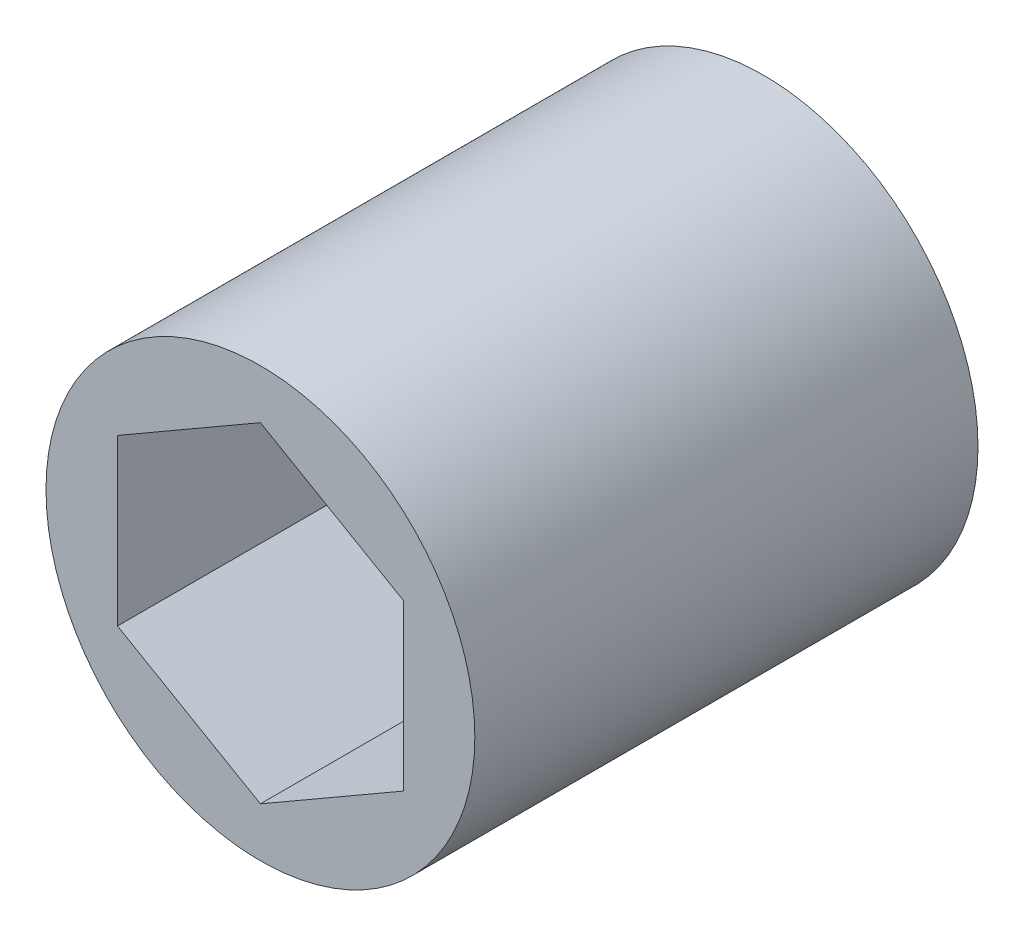
ISO-10303-21;
HEADER;
FILE_DESCRIPTION(('STEP AP214'),'2;1');
FILE_NAME('part.step','',(''),(''),'','','');
FILE_SCHEMA(('AUTOMOTIVE_DESIGN { 1 0 10303 214 1 1 1 1 }'));
ENDSEC;
DATA;
#1=APPLICATION_CONTEXT('core data for automotive mechanical design processes');
#2=APPLICATION_PROTOCOL_DEFINITION('international standard','automotive_design',2000,#1);
#3=PRODUCT_CONTEXT('',#1,'mechanical');
#4=PRODUCT('Part','Part','',(#3));
#5=PRODUCT_RELATED_PRODUCT_CATEGORY('part','',(#4));
#6=PRODUCT_DEFINITION_FORMATION('','',#4);
#7=PRODUCT_DEFINITION_CONTEXT('part definition',#1,'design');
#8=PRODUCT_DEFINITION('design','',#6,#7);
#9=PRODUCT_DEFINITION_SHAPE('','',#8);
#10=(LENGTH_UNIT() NAMED_UNIT(*) SI_UNIT(.MILLI.,.METRE.));
#11=(NAMED_UNIT(*) PLANE_ANGLE_UNIT() SI_UNIT($,.RADIAN.));
#12=(NAMED_UNIT(*) SI_UNIT($,.STERADIAN.) SOLID_ANGLE_UNIT());
#13=UNCERTAINTY_MEASURE_WITH_UNIT(LENGTH_MEASURE(1.E-05),#10,'distance_accuracy_value','');
#14=(GEOMETRIC_REPRESENTATION_CONTEXT(3) GLOBAL_UNCERTAINTY_ASSIGNED_CONTEXT((#13)) GLOBAL_UNIT_ASSIGNED_CONTEXT((#10,
#11,#12)) REPRESENTATION_CONTEXT('',''));
#15=CARTESIAN_POINT('',(0.,0.,0.));
#16=DIRECTION('',(0.,0.,1.));
#17=DIRECTION('',(1.,0.,0.));
#18=AXIS2_PLACEMENT_3D('',#15,#16,#17);
#19=CARTESIAN_POINT('',(0.,0.,22.352));
#20=DIRECTION('',(0.,0.,1.));
#21=DIRECTION('',(1.,0.,0.));
#22=AXIS2_PLACEMENT_3D('',#19,#20,#21);
#23=PLANE('',#22);
#24=CARTESIAN_POINT('',(0.,0.,22.352));
#25=DIRECTION('',(0.,0.,1.));
#26=DIRECTION('',(1.,0.,0.));
#27=AXIS2_PLACEMENT_3D('',#24,#25,#26);
#28=CIRCLE('',#27,9.525);
#29=CARTESIAN_POINT('',(9.525,0.,22.352));
#30=VERTEX_POINT('',#29);
#31=EDGE_CURVE('E11',#30,#30,#28,.T.);
#32=ORIENTED_EDGE('',*,*,#31,.T.);
#33=EDGE_LOOP('',(#32));
#34=FACE_BOUND('',#33,.T.);
#35=DIRECTION('',(-0.866025403784438,-0.5,0.));
#36=VECTOR('',#35,1.);
#37=CARTESIAN_POINT('',(0.,7.33234841870825,22.352));
#38=LINE('',#37,#36);
#39=CARTESIAN_POINT('',(0.,7.33234841870825,22.352));
#40=VERTEX_POINT('',#39);
#41=CARTESIAN_POINT('',(-6.35,3.66617420935412,22.352));
#42=VERTEX_POINT('',#41);
#43=EDGE_CURVE('E108',#40,#42,#38,.T.);
#44=ORIENTED_EDGE('',*,*,#43,.F.);
#45=DIRECTION('',(-0.866025403784439,0.5,0.));
#46=VECTOR('',#45,1.);
#47=CARTESIAN_POINT('',(6.35,3.66617420935412,22.352));
#48=LINE('',#47,#46);
#49=CARTESIAN_POINT('',(6.35,3.66617420935412,22.352));
#50=VERTEX_POINT('',#49);
#51=EDGE_CURVE('E99',#50,#40,#48,.T.);
#52=ORIENTED_EDGE('',*,*,#51,.F.);
#53=DIRECTION('',(0.,1.,0.));
#54=VECTOR('',#53,1.);
#55=CARTESIAN_POINT('',(6.35,-3.66617420935412,22.352));
#56=LINE('',#55,#54);
#57=CARTESIAN_POINT('',(6.35,-3.66617420935412,22.352));
#58=VERTEX_POINT('',#57);
#59=EDGE_CURVE('E133',#58,#50,#56,.T.);
#60=ORIENTED_EDGE('',*,*,#59,.F.);
#61=DIRECTION('',(0.866025403784439,0.5,0.));
#62=VECTOR('',#61,1.);
#63=CARTESIAN_POINT('',(0.,-7.33234841870825,22.352));
#64=LINE('',#63,#62);
#65=CARTESIAN_POINT('',(0.,-7.33234841870825,22.352));
#66=VERTEX_POINT('',#65);
#67=EDGE_CURVE('E130',#66,#58,#64,.T.);
#68=ORIENTED_EDGE('',*,*,#67,.F.);
#69=DIRECTION('',(0.866025403784439,-0.5,0.));
#70=VECTOR('',#69,1.);
#71=CARTESIAN_POINT('',(-6.35,-3.66617420935412,22.352));
#72=LINE('',#71,#70);
#73=CARTESIAN_POINT('',(-6.35,-3.66617420935412,22.352));
#74=VERTEX_POINT('',#73);
#75=EDGE_CURVE('E125',#74,#66,#72,.T.);
#76=ORIENTED_EDGE('',*,*,#75,.F.);
#77=DIRECTION('',(0.,-1.,0.));
#78=VECTOR('',#77,1.);
#79=CARTESIAN_POINT('',(-6.35,3.66617420935412,22.352));
#80=LINE('',#79,#78);
#81=EDGE_CURVE('E121',#42,#74,#80,.T.);
#82=ORIENTED_EDGE('',*,*,#81,.F.);
#83=EDGE_LOOP('',(#44,#52,#60,#68,#76,#82));
#84=FACE_BOUND('',#83,.T.);
#85=ADVANCED_FACE('F45',(#34,#84),#23,.T.);
#86=CARTESIAN_POINT('',(0.,0.,0.));
#87=DIRECTION('',(0.,0.,1.));
#88=DIRECTION('',(1.,0.,0.));
#89=AXIS2_PLACEMENT_3D('',#86,#87,#88);
#90=PLANE('',#89);
#91=CARTESIAN_POINT('',(0.,0.,0.));
#92=DIRECTION('',(0.,0.,1.));
#93=DIRECTION('',(1.,0.,0.));
#94=AXIS2_PLACEMENT_3D('',#91,#92,#93);
#95=CIRCLE('',#94,9.525);
#96=CARTESIAN_POINT('',(9.525,0.,0.));
#97=VERTEX_POINT('',#96);
#98=EDGE_CURVE('E49',#97,#97,#95,.T.);
#99=ORIENTED_EDGE('',*,*,#98,.F.);
#100=EDGE_LOOP('',(#99));
#101=FACE_BOUND('',#100,.T.);
#102=DIRECTION('',(-0.866025403784439,0.5,0.));
#103=VECTOR('',#102,1.);
#104=CARTESIAN_POINT('',(6.35,3.66617420935412,0.));
#105=LINE('',#104,#103);
#106=CARTESIAN_POINT('',(6.35,3.66617420935412,0.));
#107=VERTEX_POINT('',#106);
#108=CARTESIAN_POINT('',(0.,7.33234841870825,0.));
#109=VERTEX_POINT('',#108);
#110=EDGE_CURVE('E69',#107,#109,#105,.T.);
#111=ORIENTED_EDGE('',*,*,#110,.T.);
#112=DIRECTION('',(-0.866025403784438,-0.5,0.));
#113=VECTOR('',#112,1.);
#114=CARTESIAN_POINT('',(0.,7.33234841870825,0.));
#115=LINE('',#114,#113);
#116=CARTESIAN_POINT('',(-6.35,3.66617420935412,0.));
#117=VERTEX_POINT('',#116);
#118=EDGE_CURVE('E115',#109,#117,#115,.T.);
#119=ORIENTED_EDGE('',*,*,#118,.T.);
#120=DIRECTION('',(0.,-1.,0.));
#121=VECTOR('',#120,1.);
#122=CARTESIAN_POINT('',(-6.35,3.66617420935412,0.));
#123=LINE('',#122,#121);
#124=CARTESIAN_POINT('',(-6.35,-3.66617420935412,0.));
#125=VERTEX_POINT('',#124);
#126=EDGE_CURVE('E140',#117,#125,#123,.T.);
#127=ORIENTED_EDGE('',*,*,#126,.T.);
#128=DIRECTION('',(0.866025403784439,-0.5,0.));
#129=VECTOR('',#128,1.);
#130=CARTESIAN_POINT('',(-6.35,-3.66617420935412,0.));
#131=LINE('',#130,#129);
#132=CARTESIAN_POINT('',(0.,-7.33234841870825,0.));
#133=VERTEX_POINT('',#132);
#134=EDGE_CURVE('E144',#125,#133,#131,.T.);
#135=ORIENTED_EDGE('',*,*,#134,.T.);
#136=DIRECTION('',(0.866025403784439,0.5,0.));
#137=VECTOR('',#136,1.);
#138=CARTESIAN_POINT('',(0.,-7.33234841870825,0.));
#139=LINE('',#138,#137);
#140=CARTESIAN_POINT('',(6.35,-3.66617420935412,0.));
#141=VERTEX_POINT('',#140);
#142=EDGE_CURVE('E148',#133,#141,#139,.T.);
#143=ORIENTED_EDGE('',*,*,#142,.T.);
#144=DIRECTION('',(0.,1.,0.));
#145=VECTOR('',#144,1.);
#146=CARTESIAN_POINT('',(6.35,-3.66617420935412,0.));
#147=LINE('',#146,#145);
#148=EDGE_CURVE('E109',#141,#107,#147,.T.);
#149=ORIENTED_EDGE('',*,*,#148,.T.);
#150=EDGE_LOOP('',(#111,#119,#127,#135,#143,#149));
#151=FACE_BOUND('',#150,.T.);
#152=ADVANCED_FACE('F172',(#101,#151),#90,.F.);
#153=CARTESIAN_POINT('',(0.,0.,22.352));
#154=DIRECTION('',(0.,0.,-1.));
#155=DIRECTION('',(-1.,0.,0.));
#156=AXIS2_PLACEMENT_3D('',#153,#154,#155);
#157=CYLINDRICAL_SURFACE('',#156,9.525);
#158=ORIENTED_EDGE('',*,*,#31,.F.);
#159=EDGE_LOOP('',(#158));
#160=FACE_BOUND('',#159,.T.);
#161=ORIENTED_EDGE('',*,*,#98,.T.);
#162=EDGE_LOOP('',(#161));
#163=FACE_BOUND('',#162,.T.);
#164=ADVANCED_FACE('F47',(#160,#163),#157,.T.);
#165=CARTESIAN_POINT('',(6.35,3.66617420935412,22.352));
#166=DIRECTION('',(-0.5,-0.866025403784439,0.));
#167=DIRECTION('',(0.866025403784439,-0.5,0.));
#168=AXIS2_PLACEMENT_3D('',#165,#166,#167);
#169=PLANE('',#168);
#170=ORIENTED_EDGE('',*,*,#110,.F.);
#171=DIRECTION('',(0.,0.,-1.));
#172=VECTOR('',#171,1.);
#173=CARTESIAN_POINT('',(6.35,3.66617420935412,22.352));
#174=LINE('',#173,#172);
#175=EDGE_CURVE('E103',#50,#107,#174,.T.);
#176=ORIENTED_EDGE('',*,*,#175,.F.);
#177=ORIENTED_EDGE('',*,*,#51,.T.);
#178=DIRECTION('',(0.,0.,-1.));
#179=VECTOR('',#178,1.);
#180=CARTESIAN_POINT('',(0.,7.33234841870825,22.352));
#181=LINE('',#180,#179);
#182=EDGE_CURVE('E102',#40,#109,#181,.T.);
#183=ORIENTED_EDGE('',*,*,#182,.T.);
#184=EDGE_LOOP('',(#170,#176,#177,#183));
#185=FACE_BOUND('',#184,.T.);
#186=ADVANCED_FACE('F101',(#185),#169,.T.);
#187=CARTESIAN_POINT('',(0.,7.33234841870825,22.352));
#188=DIRECTION('',(0.5,-0.866025403784439,0.));
#189=DIRECTION('',(0.866025403784439,0.5,0.));
#190=AXIS2_PLACEMENT_3D('',#187,#188,#189);
#191=PLANE('',#190);
#192=ORIENTED_EDGE('',*,*,#118,.F.);
#193=ORIENTED_EDGE('',*,*,#182,.F.);
#194=ORIENTED_EDGE('',*,*,#43,.T.);
#195=DIRECTION('',(0.,0.,-1.));
#196=VECTOR('',#195,1.);
#197=CARTESIAN_POINT('',(-6.35,3.66617420935412,22.352));
#198=LINE('',#197,#196);
#199=EDGE_CURVE('E117',#42,#117,#198,.T.);
#200=ORIENTED_EDGE('',*,*,#199,.T.);
#201=EDGE_LOOP('',(#192,#193,#194,#200));
#202=FACE_BOUND('',#201,.T.);
#203=ADVANCED_FACE('F112',(#202),#191,.T.);
#204=CARTESIAN_POINT('',(-6.35,3.66617420935412,22.352));
#205=DIRECTION('',(1.,0.,0.));
#206=DIRECTION('',(0.,1.,0.));
#207=AXIS2_PLACEMENT_3D('',#204,#205,#206);
#208=PLANE('',#207);
#209=ORIENTED_EDGE('',*,*,#126,.F.);
#210=ORIENTED_EDGE('',*,*,#199,.F.);
#211=ORIENTED_EDGE('',*,*,#81,.T.);
#212=DIRECTION('',(0.,0.,-1.));
#213=VECTOR('',#212,1.);
#214=CARTESIAN_POINT('',(-6.35,-3.66617420935412,22.352));
#215=LINE('',#214,#213);
#216=EDGE_CURVE('E162',#74,#125,#215,.T.);
#217=ORIENTED_EDGE('',*,*,#216,.T.);
#218=EDGE_LOOP('',(#209,#210,#211,#217));
#219=FACE_BOUND('',#218,.T.);
#220=ADVANCED_FACE('F168',(#219),#208,.T.);
#221=CARTESIAN_POINT('',(-6.35,-3.66617420935412,22.352));
#222=DIRECTION('',(0.5,0.866025403784439,0.));
#223=DIRECTION('',(-0.866025403784439,0.5,0.));
#224=AXIS2_PLACEMENT_3D('',#221,#222,#223);
#225=PLANE('',#224);
#226=ORIENTED_EDGE('',*,*,#134,.F.);
#227=ORIENTED_EDGE('',*,*,#216,.F.);
#228=ORIENTED_EDGE('',*,*,#75,.T.);
#229=DIRECTION('',(0.,0.,-1.));
#230=VECTOR('',#229,1.);
#231=CARTESIAN_POINT('',(0.,-7.33234841870825,22.352));
#232=LINE('',#231,#230);
#233=EDGE_CURVE('E159',#66,#133,#232,.T.);
#234=ORIENTED_EDGE('',*,*,#233,.T.);
#235=EDGE_LOOP('',(#226,#227,#228,#234));
#236=FACE_BOUND('',#235,.T.);
#237=ADVANCED_FACE('F180',(#236),#225,.T.);
#238=CARTESIAN_POINT('',(0.,-7.33234841870825,22.352));
#239=DIRECTION('',(-0.5,0.866025403784439,0.));
#240=DIRECTION('',(-0.866025403784439,-0.5,0.));
#241=AXIS2_PLACEMENT_3D('',#238,#239,#240);
#242=PLANE('',#241);
#243=ORIENTED_EDGE('',*,*,#142,.F.);
#244=ORIENTED_EDGE('',*,*,#233,.F.);
#245=ORIENTED_EDGE('',*,*,#67,.T.);
#246=DIRECTION('',(0.,0.,-1.));
#247=VECTOR('',#246,1.);
#248=CARTESIAN_POINT('',(6.35,-3.66617420935412,22.352));
#249=LINE('',#248,#247);
#250=EDGE_CURVE('E61',#58,#141,#249,.T.);
#251=ORIENTED_EDGE('',*,*,#250,.T.);
#252=EDGE_LOOP('',(#243,#244,#245,#251));
#253=FACE_BOUND('',#252,.T.);
#254=ADVANCED_FACE('F178',(#253),#242,.T.);
#255=CARTESIAN_POINT('',(6.35,-3.66617420935412,22.352));
#256=DIRECTION('',(-1.,0.,0.));
#257=DIRECTION('',(0.,-1.,0.));
#258=AXIS2_PLACEMENT_3D('',#255,#256,#257);
#259=PLANE('',#258);
#260=ORIENTED_EDGE('',*,*,#148,.F.);
#261=ORIENTED_EDGE('',*,*,#250,.F.);
#262=ORIENTED_EDGE('',*,*,#59,.T.);
#263=ORIENTED_EDGE('',*,*,#175,.T.);
#264=EDGE_LOOP('',(#260,#261,#262,#263));
#265=FACE_BOUND('',#264,.T.);
#266=ADVANCED_FACE('F174',(#265),#259,.T.);
#267=CLOSED_SHELL('',(#85,#152,#164,#186,#203,#220,#237,#254,#266));
#268=MANIFOLD_SOLID_BREP('B2',#267);
#269=ADVANCED_BREP_SHAPE_REPRESENTATION('',(#18,#268),#14);
#270=SHAPE_DEFINITION_REPRESENTATION(#9,#269);
ENDSEC;
END-ISO-10303-21;
